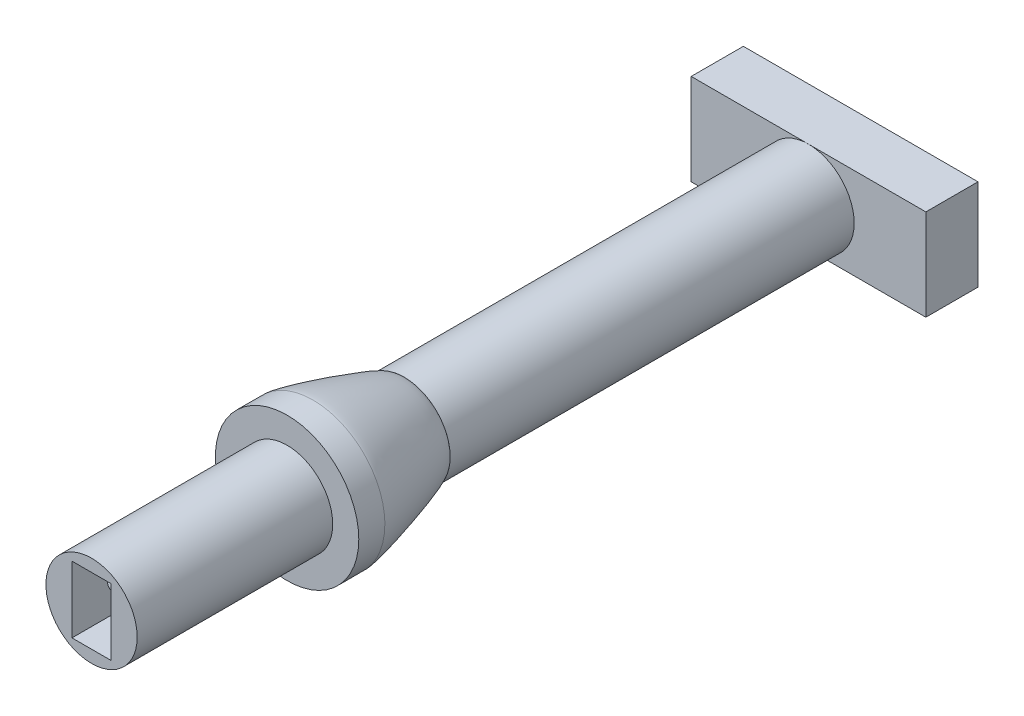
ISO-10303-21;
HEADER;
FILE_DESCRIPTION(('STEP AP214'),'2;1');
FILE_NAME('part.step','',(''),(''),'','','');
FILE_SCHEMA(('AUTOMOTIVE_DESIGN { 1 0 10303 214 1 1 1 1 }'));
ENDSEC;
DATA;
#1=APPLICATION_CONTEXT('core data for automotive mechanical design processes');
#2=APPLICATION_PROTOCOL_DEFINITION('international standard','automotive_design',2000,#1);
#3=PRODUCT_CONTEXT('',#1,'mechanical');
#4=PRODUCT('Part','Part','',(#3));
#5=PRODUCT_RELATED_PRODUCT_CATEGORY('part','',(#4));
#6=PRODUCT_DEFINITION_FORMATION('','',#4);
#7=PRODUCT_DEFINITION_CONTEXT('part definition',#1,'design');
#8=PRODUCT_DEFINITION('design','',#6,#7);
#9=PRODUCT_DEFINITION_SHAPE('','',#8);
#10=(LENGTH_UNIT() NAMED_UNIT(*) SI_UNIT(.MILLI.,.METRE.));
#11=(NAMED_UNIT(*) PLANE_ANGLE_UNIT() SI_UNIT($,.RADIAN.));
#12=(NAMED_UNIT(*) SI_UNIT($,.STERADIAN.) SOLID_ANGLE_UNIT());
#13=UNCERTAINTY_MEASURE_WITH_UNIT(LENGTH_MEASURE(1.E-05),#10,'distance_accuracy_value','');
#14=(GEOMETRIC_REPRESENTATION_CONTEXT(3) GLOBAL_UNCERTAINTY_ASSIGNED_CONTEXT((#13)) GLOBAL_UNIT_ASSIGNED_CONTEXT((#10,
#11,#12)) REPRESENTATION_CONTEXT('',''));
#15=CARTESIAN_POINT('',(0.,0.,0.));
#16=DIRECTION('',(0.,0.,1.));
#17=DIRECTION('',(1.,0.,0.));
#18=AXIS2_PLACEMENT_3D('',#15,#16,#17);
#19=CARTESIAN_POINT('',(0.,0.,59.));
#20=DIRECTION('',(0.,0.,-1.));
#21=DIRECTION('',(-1.,0.,0.));
#22=AXIS2_PLACEMENT_3D('',#19,#20,#21);
#23=CYLINDRICAL_SURFACE('',#22,3.5);
#24=CARTESIAN_POINT('',(0.,0.,4.));
#25=DIRECTION('',(0.,0.,1.));
#26=DIRECTION('',(1.,0.,0.));
#27=AXIS2_PLACEMENT_3D('',#24,#25,#26);
#28=CIRCLE('',#27,3.5);
#29=CARTESIAN_POINT('',(0.,3.5,4.));
#30=VERTEX_POINT('',#29);
#31=CARTESIAN_POINT('',(0.,-3.5,4.));
#32=VERTEX_POINT('',#31);
#33=EDGE_CURVE('E176',#30,#32,#28,.T.);
#34=ORIENTED_EDGE('',*,*,#33,.T.);
#35=EDGE_CURVE('E75',#32,#30,#28,.T.);
#36=ORIENTED_EDGE('',*,*,#35,.T.);
#37=EDGE_LOOP('',(#34,#36));
#38=FACE_BOUND('',#37,.T.);
#39=CARTESIAN_POINT('',(3.5,0.,35.));
#40=CARTESIAN_POINT('',(3.5,0.458148922415161,35.));
#41=CARTESIAN_POINT('',(3.40890436595365,0.916117601016367,35.));
#42=CARTESIAN_POINT('',(3.05825236162537,1.76266642553926,35.));
#43=CARTESIAN_POINT('',(2.79883394398591,2.15091352431983,35.));
#44=CARTESIAN_POINT('',(2.15091352431993,2.79883394398601,35.));
#45=CARTESIAN_POINT('',(1.7626664255393,3.05825236162543,35.));
#46=CARTESIAN_POINT('',(0.916117601016333,3.40890436595358,35.));
#47=CARTESIAN_POINT('',(0.458148922415193,3.5,35.));
#48=CARTESIAN_POINT('',(-0.458148922415193,3.5,35.));
#49=CARTESIAN_POINT('',(-0.916117601016335,3.40890436595368,35.));
#50=CARTESIAN_POINT('',(-1.7626664255393,3.05825236162533,35.));
#51=CARTESIAN_POINT('',(-2.15091352431986,2.79883394398598,35.));
#52=CARTESIAN_POINT('',(-2.79883394398599,2.15091352431985,35.));
#53=CARTESIAN_POINT('',(-3.05825236162517,1.76266642553932,35.));
#54=CARTESIAN_POINT('',(-3.40890436595384,0.91611760101632,35.));
#55=CARTESIAN_POINT('',(-3.5,0.458148922415194,35.));
#56=CARTESIAN_POINT('',(-3.5,-0.458148922415193,35.));
#57=CARTESIAN_POINT('',(-3.40890436595384,-0.916117601016261,35.));
#58=CARTESIAN_POINT('',(-3.05825236162517,-1.76266642553936,35.));
#59=CARTESIAN_POINT('',(-2.79883394398608,-2.15091352431976,35.));
#60=CARTESIAN_POINT('',(-2.15091352431975,-2.79883394398608,35.));
#61=CARTESIAN_POINT('',(-1.76266642553933,-3.05825236162529,35.));
#62=CARTESIAN_POINT('',(-0.916117601016308,-3.40890436595372,35.));
#63=CARTESIAN_POINT('',(-0.458148922415188,-3.5,35.));
#64=CARTESIAN_POINT('',(0.458148922415199,-3.5,35.));
#65=CARTESIAN_POINT('',(0.916117601016347,-3.40890436595372,35.));
#66=CARTESIAN_POINT('',(1.76266642553927,-3.0582523616253,35.));
#67=CARTESIAN_POINT('',(2.15091352431984,-2.7988339439861,35.));
#68=CARTESIAN_POINT('',(2.79883394398598,-2.15091352431976,35.));
#69=CARTESIAN_POINT('',(3.05825236162529,-1.76266642553933,35.));
#70=CARTESIAN_POINT('',(3.40890436595372,-0.916117601016308,35.));
#71=CARTESIAN_POINT('',(3.5,-0.458148922415162,35.));
#72=CARTESIAN_POINT('',(3.5,0.,35.));
#73=(BOUNDED_CURVE() B_SPLINE_CURVE(3,(#39,#40,#41,#42,#43,#44,#45,#46,#47,#48,#49,#50,#51,#52,
#53,#54,#55,#56,#57,#58,#59,#60,#61,#62,#63,#64,#65,#66,#67,#68,#69,#70,#71,#72),.UNSPECIFIED.,
.T.,.F.) B_SPLINE_CURVE_WITH_KNOTS((4,2,2,2,2,2,2,2,2,2,2,2,2,2,2,2,4),(0.,0.392699081698724,
0.785398163397448,1.17809724509617,1.5707963267949,1.96349540849362,2.35619449019234,
2.74889357189107,3.14159265358979,3.53429173528852,3.92699081698724,4.31968989868597,
4.71238898038469,5.10508806208341,5.49778714378214,5.89048622548086,6.28318530717959),
.UNSPECIFIED.) CURVE() GEOMETRIC_REPRESENTATION_ITEM() RATIONAL_B_SPLINE_CURVE((1.,1.,1.,1.,1.,
1.,1.,1.,1.,1.,1.,1.,1.,1.,1.,1.,1.,1.,1.,1.,1.,1.,1.,1.,1.,1.,1.,1.,1.,1.,1.,1.,1.,1.)) REPRESENTATION_ITEM(''));
#74=CARTESIAN_POINT('',(3.5,0.,35.));
#75=VERTEX_POINT('',#74);
#76=EDGE_CURVE('E60',#75,#75,#73,.T.);
#77=ORIENTED_EDGE('',*,*,#76,.F.);
#78=EDGE_LOOP('',(#77));
#79=FACE_BOUND('',#78,.T.);
#80=ADVANCED_FACE('F44',(#38,#79),#23,.T.);
#81=CARTESIAN_POINT('',(0.,0.,4.));
#82=DIRECTION('',(0.,0.,1.));
#83=DIRECTION('',(1.,0.,0.));
#84=AXIS2_PLACEMENT_3D('',#81,#82,#83);
#85=PLANE('',#84);
#86=ORIENTED_EDGE('',*,*,#33,.F.);
#87=DIRECTION('',(-1.,0.,0.));
#88=VECTOR('',#87,1.);
#89=CARTESIAN_POINT('',(-9.00000000000001,3.5,4.));
#90=LINE('',#89,#88);
#91=CARTESIAN_POINT('',(-9.00000000000001,3.5,4.));
#92=VERTEX_POINT('',#91);
#93=EDGE_CURVE('E194',#30,#92,#90,.T.);
#94=ORIENTED_EDGE('',*,*,#93,.T.);
#95=DIRECTION('',(0.,-1.,0.));
#96=VECTOR('',#95,1.);
#97=CARTESIAN_POINT('',(-9.00000000000001,3.5,4.));
#98=LINE('',#97,#96);
#99=CARTESIAN_POINT('',(-9.00000000000001,-3.5,4.));
#100=VERTEX_POINT('',#99);
#101=EDGE_CURVE('E199',#92,#100,#98,.T.);
#102=ORIENTED_EDGE('',*,*,#101,.T.);
#103=DIRECTION('',(1.,0.,0.));
#104=VECTOR('',#103,1.);
#105=CARTESIAN_POINT('',(-9.00000000000001,-3.5,4.));
#106=LINE('',#105,#104);
#107=EDGE_CURVE('E203',#100,#32,#106,.T.);
#108=ORIENTED_EDGE('',*,*,#107,.T.);
#109=EDGE_LOOP('',(#86,#94,#102,#108));
#110=FACE_BOUND('',#109,.T.);
#111=ADVANCED_FACE('F292',(#110),#85,.T.);
#112=CARTESIAN_POINT('',(8.99999999999999,3.5,4.));
#113=DIRECTION('',(-1.,0.,0.));
#114=DIRECTION('',(0.,0.,1.));
#115=AXIS2_PLACEMENT_3D('',#112,#113,#114);
#116=PLANE('',#115);
#117=DIRECTION('',(0.,1.,0.));
#118=VECTOR('',#117,1.);
#119=CARTESIAN_POINT('',(8.99999999999999,3.5,0.));
#120=LINE('',#119,#118);
#121=CARTESIAN_POINT('',(8.99999999999999,-3.5,0.));
#122=VERTEX_POINT('',#121);
#123=CARTESIAN_POINT('',(8.99999999999999,3.5,0.));
#124=VERTEX_POINT('',#123);
#125=EDGE_CURVE('E186',#122,#124,#120,.T.);
#126=ORIENTED_EDGE('',*,*,#125,.T.);
#127=DIRECTION('',(0.,0.,-1.));
#128=VECTOR('',#127,1.);
#129=CARTESIAN_POINT('',(8.99999999999999,3.5,4.));
#130=LINE('',#129,#128);
#131=CARTESIAN_POINT('',(8.99999999999999,3.5,4.));
#132=VERTEX_POINT('',#131);
#133=EDGE_CURVE('E230',#132,#124,#130,.T.);
#134=ORIENTED_EDGE('',*,*,#133,.F.);
#135=DIRECTION('',(0.,1.,0.));
#136=VECTOR('',#135,1.);
#137=CARTESIAN_POINT('',(8.99999999999999,3.5,4.));
#138=LINE('',#137,#136);
#139=CARTESIAN_POINT('',(8.99999999999999,-3.5,4.));
#140=VERTEX_POINT('',#139);
#141=EDGE_CURVE('E190',#140,#132,#138,.T.);
#142=ORIENTED_EDGE('',*,*,#141,.F.);
#143=DIRECTION('',(0.,0.,-1.));
#144=VECTOR('',#143,1.);
#145=CARTESIAN_POINT('',(8.99999999999999,-3.5,4.));
#146=LINE('',#145,#144);
#147=EDGE_CURVE('E207',#140,#122,#146,.T.);
#148=ORIENTED_EDGE('',*,*,#147,.T.);
#149=EDGE_LOOP('',(#126,#134,#142,#148));
#150=FACE_BOUND('',#149,.T.);
#151=ADVANCED_FACE('F305',(#150),#116,.F.);
#152=CARTESIAN_POINT('',(-9.00000000000001,3.5,4.));
#153=DIRECTION('',(0.,-1.,0.));
#154=DIRECTION('',(0.,0.,-1.));
#155=AXIS2_PLACEMENT_3D('',#152,#153,#154);
#156=PLANE('',#155);
#157=DIRECTION('',(-1.,0.,0.));
#158=VECTOR('',#157,1.);
#159=CARTESIAN_POINT('',(-9.00000000000001,3.5,0.));
#160=LINE('',#159,#158);
#161=CARTESIAN_POINT('',(-9.00000000000001,3.5,0.));
#162=VERTEX_POINT('',#161);
#163=EDGE_CURVE('E211',#124,#162,#160,.T.);
#164=ORIENTED_EDGE('',*,*,#163,.T.);
#165=DIRECTION('',(0.,0.,-1.));
#166=VECTOR('',#165,1.);
#167=CARTESIAN_POINT('',(-9.00000000000001,3.5,4.));
#168=LINE('',#167,#166);
#169=EDGE_CURVE('E226',#92,#162,#168,.T.);
#170=ORIENTED_EDGE('',*,*,#169,.F.);
#171=ORIENTED_EDGE('',*,*,#93,.F.);
#172=EDGE_CURVE('E196',#132,#30,#90,.T.);
#173=ORIENTED_EDGE('',*,*,#172,.F.);
#174=ORIENTED_EDGE('',*,*,#133,.T.);
#175=EDGE_LOOP('',(#164,#170,#171,#173,#174));
#176=FACE_BOUND('',#175,.T.);
#177=ADVANCED_FACE('F302',(#176),#156,.F.);
#178=CARTESIAN_POINT('',(-9.00000000000001,3.5,4.));
#179=DIRECTION('',(1.,0.,0.));
#180=DIRECTION('',(0.,1.,0.));
#181=AXIS2_PLACEMENT_3D('',#178,#179,#180);
#182=PLANE('',#181);
#183=DIRECTION('',(0.,-1.,0.));
#184=VECTOR('',#183,1.);
#185=CARTESIAN_POINT('',(-9.00000000000001,3.5,0.));
#186=LINE('',#185,#184);
#187=CARTESIAN_POINT('',(-9.00000000000001,-3.5,0.));
#188=VERTEX_POINT('',#187);
#189=EDGE_CURVE('E214',#162,#188,#186,.T.);
#190=ORIENTED_EDGE('',*,*,#189,.T.);
#191=DIRECTION('',(0.,0.,-1.));
#192=VECTOR('',#191,1.);
#193=CARTESIAN_POINT('',(-9.00000000000001,-3.5,4.));
#194=LINE('',#193,#192);
#195=EDGE_CURVE('E222',#100,#188,#194,.T.);
#196=ORIENTED_EDGE('',*,*,#195,.F.);
#197=ORIENTED_EDGE('',*,*,#101,.F.);
#198=ORIENTED_EDGE('',*,*,#169,.T.);
#199=EDGE_LOOP('',(#190,#196,#197,#198));
#200=FACE_BOUND('',#199,.T.);
#201=ADVANCED_FACE('F298',(#200),#182,.F.);
#202=CARTESIAN_POINT('',(-9.00000000000001,-3.5,4.));
#203=DIRECTION('',(0.,1.,0.));
#204=DIRECTION('',(0.,0.,1.));
#205=AXIS2_PLACEMENT_3D('',#202,#203,#204);
#206=PLANE('',#205);
#207=DIRECTION('',(1.,0.,0.));
#208=VECTOR('',#207,1.);
#209=CARTESIAN_POINT('',(-9.00000000000001,-3.5,0.));
#210=LINE('',#209,#208);
#211=EDGE_CURVE('E195',#188,#122,#210,.T.);
#212=ORIENTED_EDGE('',*,*,#211,.T.);
#213=ORIENTED_EDGE('',*,*,#147,.F.);
#214=EDGE_CURVE('E202',#32,#140,#106,.T.);
#215=ORIENTED_EDGE('',*,*,#214,.F.);
#216=ORIENTED_EDGE('',*,*,#107,.F.);
#217=ORIENTED_EDGE('',*,*,#195,.T.);
#218=EDGE_LOOP('',(#212,#213,#215,#216,#217));
#219=FACE_BOUND('',#218,.T.);
#220=ADVANCED_FACE('F291',(#219),#206,.F.);
#221=ORIENTED_EDGE('',*,*,#35,.F.);
#222=ORIENTED_EDGE('',*,*,#214,.T.);
#223=ORIENTED_EDGE('',*,*,#141,.T.);
#224=ORIENTED_EDGE('',*,*,#172,.T.);
#225=EDGE_LOOP('',(#221,#222,#223,#224));
#226=FACE_BOUND('',#225,.T.);
#227=ADVANCED_FACE('F288',(#226),#85,.T.);
#228=CARTESIAN_POINT('',(0.,0.,0.));
#229=DIRECTION('',(0.,0.,1.));
#230=DIRECTION('',(1.,0.,0.));
#231=AXIS2_PLACEMENT_3D('',#228,#229,#230);
#232=PLANE('',#231);
#233=CARTESIAN_POINT('',(0.,0.,0.));
#234=DIRECTION('',(0.,0.,-1.));
#235=DIRECTION('',(-1.,0.,0.));
#236=AXIS2_PLACEMENT_3D('',#233,#234,#235);
#237=CIRCLE('',#236,1.);
#238=CARTESIAN_POINT('',(-1.,0.,0.));
#239=VERTEX_POINT('',#238);
#240=EDGE_CURVE('E373',#239,#239,#237,.T.);
#241=ORIENTED_EDGE('',*,*,#240,.F.);
#242=EDGE_LOOP('',(#241));
#243=FACE_BOUND('',#242,.T.);
#244=ORIENTED_EDGE('',*,*,#125,.F.);
#245=ORIENTED_EDGE('',*,*,#211,.F.);
#246=ORIENTED_EDGE('',*,*,#189,.F.);
#247=ORIENTED_EDGE('',*,*,#163,.F.);
#248=EDGE_LOOP('',(#244,#245,#246,#247));
#249=FACE_BOUND('',#248,.T.);
#250=ADVANCED_FACE('F258',(#243,#249),#232,.F.);
#251=CARTESIAN_POINT('',(0.,0.,35.));
#252=DIRECTION('',(0.,0.,1.));
#253=DIRECTION('',(1.,0.,0.));
#254=AXIS2_PLACEMENT_3D('',#251,#252,#253);
#255=CYLINDRICAL_SURFACE('',#254,5.5);
#256=CARTESIAN_POINT('',(5.5,0.,42.));
#257=CARTESIAN_POINT('',(5.5,-0.719948306652397,42.));
#258=CARTESIAN_POINT('',(5.35684971792728,-1.43961337302563,42.));
#259=CARTESIAN_POINT('',(4.80582513969687,-2.76990438299038,42.));
#260=CARTESIAN_POINT('',(4.39816762626376,-3.38000696678827,42.));
#261=CARTESIAN_POINT('',(3.38000696678824,-4.39816762626378,42.));
#262=CARTESIAN_POINT('',(2.76990438299028,-4.80582513969692,42.));
#263=CARTESIAN_POINT('',(1.43961337302569,-5.35684971792725,42.));
#264=CARTESIAN_POINT('',(0.719948306652456,-5.5,42.));
#265=CARTESIAN_POINT('',(-0.719948306652438,-5.5,42.));
#266=CARTESIAN_POINT('',(-1.43961337302563,-5.35684971792728,42.));
#267=CARTESIAN_POINT('',(-2.76990438299038,-4.80582513969687,42.));
#268=CARTESIAN_POINT('',(-3.3800069667882,-4.39816762626383,42.));
#269=CARTESIAN_POINT('',(-4.39816762626383,-3.3800069667882,42.));
#270=CARTESIAN_POINT('',(-4.80582513969681,-2.76990438299054,42.));
#271=CARTESIAN_POINT('',(-5.35684971792736,-1.43961337302543,42.));
#272=CARTESIAN_POINT('',(-5.5,-0.719948306652446,42.));
#273=CARTESIAN_POINT('',(-5.5,0.719948306652447,42.));
#274=CARTESIAN_POINT('',(-5.35684971792729,1.4396133730256,42.));
#275=CARTESIAN_POINT('',(-4.80582513969686,2.7699043829904,42.));
#276=CARTESIAN_POINT('',(-4.39816762626363,3.38000696678839,42.));
#277=CARTESIAN_POINT('',(-3.3800069667884,4.39816762626363,42.));
#278=CARTESIAN_POINT('',(-2.76990438299035,4.80582513969689,42.));
#279=CARTESIAN_POINT('',(-1.43961337302564,5.35684971792727,42.));
#280=CARTESIAN_POINT('',(-0.719948306652446,5.5,42.));
#281=CARTESIAN_POINT('',(0.719948306652446,5.5,42.));
#282=CARTESIAN_POINT('',(1.43961337302572,5.35684971792724,42.));
#283=CARTESIAN_POINT('',(2.76990438299026,4.80582513969692,42.));
#284=CARTESIAN_POINT('',(3.38000696678845,4.39816762626358,42.));
#285=CARTESIAN_POINT('',(4.39816762626358,3.38000696678845,42.));
#286=CARTESIAN_POINT('',(4.80582513969691,2.76990438299029,42.));
#287=CARTESIAN_POINT('',(5.35684971792725,1.4396133730257,42.));
#288=CARTESIAN_POINT('',(5.5,0.719948306652396,42.));
#289=CARTESIAN_POINT('',(5.5,0.,42.));
#290=(BOUNDED_CURVE() B_SPLINE_CURVE(3,(#256,#257,#258,#259,#260,#261,#262,#263,#264,#265,#266,
#267,#268,#269,#270,#271,#272,#273,#274,#275,#276,#277,#278,#279,#280,#281,#282,#283,#284,#285,
#286,#287,#288,#289),.UNSPECIFIED.,.T.,.F.) B_SPLINE_CURVE_WITH_KNOTS((4,2,2,2,2,2,2,2,2,2,2,2,
2,2,2,2,4),(0.,0.392699081698725,0.785398163397448,1.17809724509617,1.5707963267949,
1.96349540849362,2.35619449019234,2.74889357189107,3.14159265358979,3.53429173528852,
3.92699081698724,4.31968989868597,4.71238898038469,5.10508806208341,5.49778714378214,
5.89048622548086,6.28318530717959),
.UNSPECIFIED.) CURVE() GEOMETRIC_REPRESENTATION_ITEM() RATIONAL_B_SPLINE_CURVE((1.,1.,1.,1.,1.,
1.,1.,1.,1.,1.,1.,1.,1.,1.,1.,1.,1.,1.,1.,1.,1.,1.,1.,1.,1.,1.,1.,1.,1.,1.,1.,1.,1.,1.)) REPRESENTATION_ITEM(''));
#291=CARTESIAN_POINT('',(5.5,0.,42.));
#292=VERTEX_POINT('',#291);
#293=EDGE_CURVE('E12',#292,#292,#290,.F.);
#294=ORIENTED_EDGE('',*,*,#293,.T.);
#295=EDGE_LOOP('',(#294));
#296=FACE_BOUND('',#295,.T.);
#297=CARTESIAN_POINT('',(0.,0.,44.));
#298=DIRECTION('',(0.,0.,1.));
#299=DIRECTION('',(1.,0.,0.));
#300=AXIS2_PLACEMENT_3D('',#297,#298,#299);
#301=CIRCLE('',#300,5.5);
#302=CARTESIAN_POINT('',(5.5,0.,44.));
#303=VERTEX_POINT('',#302);
#304=EDGE_CURVE('E239',#303,#303,#301,.T.);
#305=ORIENTED_EDGE('',*,*,#304,.F.);
#306=EDGE_LOOP('',(#305));
#307=FACE_BOUND('',#306,.T.);
#308=ADVANCED_FACE('F248',(#296,#307),#255,.T.);
#309=CARTESIAN_POINT('',(0.,0.,44.));
#310=DIRECTION('',(0.,0.,1.));
#311=DIRECTION('',(1.,0.,0.));
#312=AXIS2_PLACEMENT_3D('',#309,#310,#311);
#313=PLANE('',#312);
#314=CARTESIAN_POINT('',(0.,0.,44.));
#315=DIRECTION('',(0.,0.,1.));
#316=DIRECTION('',(1.,0.,0.));
#317=AXIS2_PLACEMENT_3D('',#314,#315,#316);
#318=CIRCLE('',#317,3.5);
#319=CARTESIAN_POINT('',(3.5,0.,44.));
#320=VERTEX_POINT('',#319);
#321=EDGE_CURVE('E234',#320,#320,#318,.T.);
#322=ORIENTED_EDGE('',*,*,#321,.F.);
#323=EDGE_LOOP('',(#322));
#324=FACE_BOUND('',#323,.T.);
#325=ORIENTED_EDGE('',*,*,#304,.T.);
#326=EDGE_LOOP('',(#325));
#327=FACE_BOUND('',#326,.T.);
#328=ADVANCED_FACE('F257',(#324,#327),#313,.T.);
#329=CARTESIAN_POINT('',(0.,0.,50.8));
#330=DIRECTION('',(0.,0.,1.));
#331=DIRECTION('',(1.,0.,0.));
#332=AXIS2_PLACEMENT_3D('',#329,#330,#331);
#333=PLANE('',#332);
#334=DIRECTION('',(0.,1.,0.));
#335=VECTOR('',#334,1.);
#336=CARTESIAN_POINT('',(1.5,2.55,50.8));
#337=LINE('',#336,#335);
#338=CARTESIAN_POINT('',(1.5,-2.55,50.8));
#339=VERTEX_POINT('',#338);
#340=CARTESIAN_POINT('',(1.5,2.55,50.8));
#341=VERTEX_POINT('',#340);
#342=EDGE_CURVE('E125',#339,#341,#337,.T.);
#343=ORIENTED_EDGE('',*,*,#342,.T.);
#344=DIRECTION('',(-1.,0.,0.));
#345=VECTOR('',#344,1.);
#346=CARTESIAN_POINT('',(-1.5,2.55,50.8));
#347=LINE('',#346,#345);
#348=CARTESIAN_POINT('',(-1.5,2.55,50.8));
#349=VERTEX_POINT('',#348);
#350=EDGE_CURVE('E135',#341,#349,#347,.T.);
#351=ORIENTED_EDGE('',*,*,#350,.T.);
#352=DIRECTION('',(0.,-1.,0.));
#353=VECTOR('',#352,1.);
#354=CARTESIAN_POINT('',(-1.5,2.55,50.8));
#355=LINE('',#354,#353);
#356=CARTESIAN_POINT('',(-1.5,-2.55,50.8));
#357=VERTEX_POINT('',#356);
#358=EDGE_CURVE('E141',#349,#357,#355,.T.);
#359=ORIENTED_EDGE('',*,*,#358,.T.);
#360=DIRECTION('',(1.,0.,0.));
#361=VECTOR('',#360,1.);
#362=CARTESIAN_POINT('',(-1.5,-2.55,50.8));
#363=LINE('',#362,#361);
#364=EDGE_CURVE('E132',#357,#339,#363,.T.);
#365=ORIENTED_EDGE('',*,*,#364,.T.);
#366=EDGE_LOOP('',(#343,#351,#359,#365));
#367=FACE_BOUND('',#366,.T.);
#368=ADVANCED_FACE('F143',(#367),#333,.T.);
#369=CARTESIAN_POINT('',(-1.5,2.55,50.8));
#370=DIRECTION('',(0.,1.,0.));
#371=DIRECTION('',(0.,0.,1.));
#372=AXIS2_PLACEMENT_3D('',#369,#370,#371);
#373=PLANE('',#372);
#374=DIRECTION('',(-1.,0.,0.));
#375=VECTOR('',#374,1.);
#376=CARTESIAN_POINT('',(-1.5,2.55,59.));
#377=LINE('',#376,#375);
#378=CARTESIAN_POINT('',(1.5,2.55,59.));
#379=VERTEX_POINT('',#378);
#380=CARTESIAN_POINT('',(-1.5,2.55,59.));
#381=VERTEX_POINT('',#380);
#382=EDGE_CURVE('E167',#379,#381,#377,.T.);
#383=ORIENTED_EDGE('',*,*,#382,.T.);
#384=DIRECTION('',(0.,0.,1.));
#385=VECTOR('',#384,1.);
#386=CARTESIAN_POINT('',(-1.5,2.55,50.8));
#387=LINE('',#386,#385);
#388=EDGE_CURVE('E131',#349,#381,#387,.T.);
#389=ORIENTED_EDGE('',*,*,#388,.F.);
#390=ORIENTED_EDGE('',*,*,#350,.F.);
#391=DIRECTION('',(0.,0.,1.));
#392=VECTOR('',#391,1.);
#393=CARTESIAN_POINT('',(1.5,2.55,50.8));
#394=LINE('',#393,#392);
#395=EDGE_CURVE('E121',#341,#379,#394,.T.);
#396=ORIENTED_EDGE('',*,*,#395,.T.);
#397=EDGE_LOOP('',(#383,#389,#390,#396));
#398=FACE_BOUND('',#397,.T.);
#399=ADVANCED_FACE('F136',(#398),#373,.F.);
#400=CARTESIAN_POINT('',(-1.5,-2.55,50.8));
#401=DIRECTION('',(0.,-1.,0.));
#402=DIRECTION('',(0.,0.,-1.));
#403=AXIS2_PLACEMENT_3D('',#400,#401,#402);
#404=PLANE('',#403);
#405=DIRECTION('',(1.,0.,0.));
#406=VECTOR('',#405,1.);
#407=CARTESIAN_POINT('',(-1.5,-2.55,59.));
#408=LINE('',#407,#406);
#409=CARTESIAN_POINT('',(-1.5,-2.55,59.));
#410=VERTEX_POINT('',#409);
#411=CARTESIAN_POINT('',(1.5,-2.55,59.));
#412=VERTEX_POINT('',#411);
#413=EDGE_CURVE('E146',#410,#412,#408,.T.);
#414=ORIENTED_EDGE('',*,*,#413,.T.);
#415=DIRECTION('',(0.,0.,1.));
#416=VECTOR('',#415,1.);
#417=CARTESIAN_POINT('',(1.5,-2.55,50.8));
#418=LINE('',#417,#416);
#419=EDGE_CURVE('E173',#339,#412,#418,.T.);
#420=ORIENTED_EDGE('',*,*,#419,.F.);
#421=ORIENTED_EDGE('',*,*,#364,.F.);
#422=DIRECTION('',(0.,0.,1.));
#423=VECTOR('',#422,1.);
#424=CARTESIAN_POINT('',(-1.5,-2.55,50.8));
#425=LINE('',#424,#423);
#426=EDGE_CURVE('E177',#357,#410,#425,.T.);
#427=ORIENTED_EDGE('',*,*,#426,.T.);
#428=EDGE_LOOP('',(#414,#420,#421,#427));
#429=FACE_BOUND('',#428,.T.);
#430=ADVANCED_FACE('F270',(#429),#404,.F.);
#431=CARTESIAN_POINT('',(1.5,2.55,50.8));
#432=DIRECTION('',(1.,0.,0.));
#433=DIRECTION('',(0.,1.,0.));
#434=AXIS2_PLACEMENT_3D('',#431,#432,#433);
#435=PLANE('',#434);
#436=DIRECTION('',(0.,1.,0.));
#437=VECTOR('',#436,1.);
#438=CARTESIAN_POINT('',(1.5,2.55,59.));
#439=LINE('',#438,#437);
#440=EDGE_CURVE('E67',#412,#379,#439,.T.);
#441=ORIENTED_EDGE('',*,*,#440,.T.);
#442=ORIENTED_EDGE('',*,*,#395,.F.);
#443=ORIENTED_EDGE('',*,*,#342,.F.);
#444=ORIENTED_EDGE('',*,*,#419,.T.);
#445=EDGE_LOOP('',(#441,#442,#443,#444));
#446=FACE_BOUND('',#445,.T.);
#447=ADVANCED_FACE('F123',(#446),#435,.F.);
#448=CARTESIAN_POINT('',(-1.5,2.55,50.8));
#449=DIRECTION('',(-1.,0.,0.));
#450=DIRECTION('',(0.,-1.,0.));
#451=AXIS2_PLACEMENT_3D('',#448,#449,#450);
#452=PLANE('',#451);
#453=CARTESIAN_POINT('',(-1.5,0.,54.8));
#454=DIRECTION('',(1.,0.,0.));
#455=DIRECTION('',(0.,1.,0.));
#456=AXIS2_PLACEMENT_3D('',#453,#454,#455);
#457=CIRCLE('',#456,1.5);
#458=CARTESIAN_POINT('',(-1.5,1.5,54.8));
#459=VERTEX_POINT('',#458);
#460=EDGE_CURVE('E238',#459,#459,#457,.T.);
#461=ORIENTED_EDGE('',*,*,#460,.F.);
#462=EDGE_LOOP('',(#461));
#463=FACE_BOUND('',#462,.T.);
#464=DIRECTION('',(0.,-1.,0.));
#465=VECTOR('',#464,1.);
#466=CARTESIAN_POINT('',(-1.5,2.55,59.));
#467=LINE('',#466,#465);
#468=EDGE_CURVE('E150',#381,#410,#467,.T.);
#469=ORIENTED_EDGE('',*,*,#468,.T.);
#470=ORIENTED_EDGE('',*,*,#426,.F.);
#471=ORIENTED_EDGE('',*,*,#358,.F.);
#472=ORIENTED_EDGE('',*,*,#388,.T.);
#473=EDGE_LOOP('',(#469,#470,#471,#472));
#474=FACE_BOUND('',#473,.T.);
#475=ADVANCED_FACE('F274',(#463,#474),#452,.F.);
#476=CARTESIAN_POINT('',(0.,0.,59.));
#477=DIRECTION('',(0.,0.,1.));
#478=DIRECTION('',(1.,0.,0.));
#479=AXIS2_PLACEMENT_3D('',#476,#477,#478);
#480=PLANE('',#479);
#481=ORIENTED_EDGE('',*,*,#440,.F.);
#482=ORIENTED_EDGE('',*,*,#413,.F.);
#483=ORIENTED_EDGE('',*,*,#468,.F.);
#484=ORIENTED_EDGE('',*,*,#382,.F.);
#485=EDGE_LOOP('',(#481,#482,#483,#484));
#486=FACE_BOUND('',#485,.T.);
#487=CARTESIAN_POINT('',(0.,0.,59.));
#488=DIRECTION('',(0.,0.,1.));
#489=DIRECTION('',(1.,0.,0.));
#490=AXIS2_PLACEMENT_3D('',#487,#488,#489);
#491=CIRCLE('',#490,3.5);
#492=CARTESIAN_POINT('',(3.5,0.,59.));
#493=VERTEX_POINT('',#492);
#494=EDGE_CURVE('E182',#493,#493,#491,.T.);
#495=ORIENTED_EDGE('',*,*,#494,.T.);
#496=EDGE_LOOP('',(#495));
#497=FACE_BOUND('',#496,.T.);
#498=ADVANCED_FACE('F266',(#486,#497),#480,.T.);
#499=CARTESIAN_POINT('',(-9.00100000000001,0.,54.8));
#500=DIRECTION('',(1.,0.,0.));
#501=DIRECTION('',(0.,1.,0.));
#502=AXIS2_PLACEMENT_3D('',#499,#500,#501);
#503=CYLINDRICAL_SURFACE('',#502,1.5);
#504=ORIENTED_EDGE('',*,*,#460,.T.);
#505=EDGE_LOOP('',(#504));
#506=FACE_BOUND('',#505,.T.);
#507=CARTESIAN_POINT('',(-3.16227766016838,1.5,54.8));
#508=CARTESIAN_POINT('',(-3.16228717298615,1.49999038492545,54.7202310669546));
#509=CARTESIAN_POINT('',(-3.16534018013075,1.49359660659694,54.6403418583581));
#510=CARTESIAN_POINT('',(-3.17716042981265,1.46827542593982,54.4828833369264));
#511=CARTESIAN_POINT('',(-3.18594276667924,1.44931491353816,54.4053207198615));
#512=CARTESIAN_POINT('',(-3.20802619745321,1.39974825661799,54.2550840582022));
#513=CARTESIAN_POINT('',(-3.22130811955254,1.3691914561727,54.1823908146556));
#514=CARTESIAN_POINT('',(-3.25086693275558,1.29744502147729,54.0431820705643));
#515=CARTESIAN_POINT('',(-3.26714323581242,1.25625747429104,53.9766653609032));
#516=CARTESIAN_POINT('',(-3.30205565130511,1.16151711863134,53.8472750843835));
#517=CARTESIAN_POINT('',(-3.32077467653238,1.10737213961854,53.7848572691847));
#518=CARTESIAN_POINT('',(-3.3577839083269,0.989495816865002,53.6696486675996));
#519=CARTESIAN_POINT('',(-3.37607394135677,0.925760668427732,53.6168617205288));
#520=CARTESIAN_POINT('',(-3.41118222051011,0.786887444118552,53.5200404953643));
#521=CARTESIAN_POINT('',(-3.42789293367331,0.711357726755064,53.4765254048694));
#522=CARTESIAN_POINT('',(-3.4569371087723,0.553203581147159,53.4030178857841));
#523=CARTESIAN_POINT('',(-3.46927262014747,0.47058249723845,53.3730191240674));
#524=CARTESIAN_POINT('',(-3.48758735586713,0.305382130945822,53.3290674894389));
#525=CARTESIAN_POINT('',(-3.49387724164572,0.223047558846181,53.3143269675171));
#526=CARTESIAN_POINT('',(-3.50052462942355,0.0568497000057502,53.2987586496056));
#527=CARTESIAN_POINT('',(-3.50088468598068,-0.0270129128697541,53.2979248626218));
#528=CARTESIAN_POINT('',(-3.49581016618033,-0.188134207596879,53.3097951243902));
#529=CARTESIAN_POINT('',(-3.49074679776829,-0.265470719086097,53.3216318999745));
#530=CARTESIAN_POINT('',(-3.47591102813446,-0.416935858912371,53.3570120343274));
#531=CARTESIAN_POINT('',(-3.46613827891648,-0.491064249746505,53.3805562582134));
#532=CARTESIAN_POINT('',(-3.44263346664963,-0.635378985342398,53.4389532948628));
#533=CARTESIAN_POINT('',(-3.42884310391306,-0.705487647304975,53.4739736461748));
#534=CARTESIAN_POINT('',(-3.39863837501696,-0.839017665141783,53.5541586776779));
#535=CARTESIAN_POINT('',(-3.38222306678434,-0.90243660651252,53.5993270022658));
#536=CARTESIAN_POINT('',(-3.34696895152064,-1.02577392003805,53.7024047533429));
#537=CARTESIAN_POINT('',(-3.32804069559209,-1.08508648843664,53.7610094348956));
#538=CARTESIAN_POINT('',(-3.29078815665823,-1.19331308888253,53.8873514158162));
#539=CARTESIAN_POINT('',(-3.27246413723674,-1.24222263226407,53.9550926368739));
#540=CARTESIAN_POINT('',(-3.23783417736942,-1.32993971380651,54.1008899372612));
#541=CARTESIAN_POINT('',(-3.22162619167355,-1.36831384702014,54.179232072845));
#542=CARTESIAN_POINT('',(-3.19424697319981,-1.43107385954866,54.3421445042791));
#543=CARTESIAN_POINT('',(-3.18307189830842,-1.45547041320372,54.4267099916605));
#544=CARTESIAN_POINT('',(-3.16799275229804,-1.48799335058118,54.5935863977836));
#545=CARTESIAN_POINT('',(-3.16364898851199,-1.49710640039856,54.6756644902977));
#546=CARTESIAN_POINT('',(-3.16146494308516,-1.50171565988817,54.8402744875602));
#547=CARTESIAN_POINT('',(-3.16362218505066,-1.49721705457355,54.9228062075553));
#548=CARTESIAN_POINT('',(-3.17374071577831,-1.47563239208818,55.0799312868702));
#549=CARTESIAN_POINT('',(-3.18128847435202,-1.45944230541442,55.1546778701854));
#550=CARTESIAN_POINT('',(-3.2007978650071,-1.41614006363835,55.3003227381853));
#551=CARTESIAN_POINT('',(-3.21276056926751,-1.38902525529709,55.3712200832728));
#552=CARTESIAN_POINT('',(-3.24038333624189,-1.32334189052693,55.510604945145));
#553=CARTESIAN_POINT('',(-3.25618154123647,-1.28432659707742,55.5788536609093));
#554=CARTESIAN_POINT('',(-3.28950916992049,-1.19638562157087,55.7081753527573));
#555=CARTESIAN_POINT('',(-3.3070393706057,-1.14745548114547,55.7692450811052));
#556=CARTESIAN_POINT('',(-3.34369698282831,-1.03605747720159,55.8880144627796));
#557=CARTESIAN_POINT('',(-3.36283055507213,-0.972781802419173,55.9449576185857));
#558=CARTESIAN_POINT('',(-3.39913473749074,-0.837142334524679,56.0475671186635));
#559=CARTESIAN_POINT('',(-3.41630515097051,-0.764777632276176,56.0932323334939));
#560=CARTESIAN_POINT('',(-3.44690719585056,-0.612290393672594,56.1720413448053));
#561=CARTESIAN_POINT('',(-3.46032004460384,-0.532131490582578,56.2051225227759));
#562=CARTESIAN_POINT('',(-3.481738302467,-0.366659881518577,56.2570748994456));
#563=CARTESIAN_POINT('',(-3.48974713693763,-0.281350477650405,56.2759551003755));
#564=CARTESIAN_POINT('',(-3.49904040627988,-0.114740191834876,56.2977887288074));
#565=CARTESIAN_POINT('',(-3.50077418524232,-0.0336030421542977,56.3018069056777));
#566=CARTESIAN_POINT('',(-3.49858700907225,0.128169808807156,56.2967022452109));
#567=CARTESIAN_POINT('',(-3.49466715001972,0.208805604242763,56.2875819550501));
#568=CARTESIAN_POINT('',(-3.48185611932799,0.364022405138264,56.257223231529));
#569=CARTESIAN_POINT('',(-3.47316550610207,0.438716867066036,56.2364730162902));
#570=CARTESIAN_POINT('',(-3.45179100848821,0.583524431853931,56.1839919680782));
#571=CARTESIAN_POINT('',(-3.43910638916064,0.653636688669979,56.152259114076));
#572=CARTESIAN_POINT('',(-3.41024047270082,0.790820855389588,56.077104822088));
#573=CARTESIAN_POINT('',(-3.39392604407178,0.857608099366128,56.0332161473868));
#574=CARTESIAN_POINT('',(-3.35970811620735,0.983159576175439,55.9356600352708));
#575=CARTESIAN_POINT('',(-3.341803989688,1.04192061850001,55.8819887288223));
#576=CARTESIAN_POINT('',(-3.30477972078024,1.15419921481672,55.7618044913906));
#577=CARTESIAN_POINT('',(-3.28566570654981,1.20702595263292,55.6946419918799));
#578=CARTESIAN_POINT('',(-3.24969238680824,1.30078077887624,55.5518407424578));
#579=CARTESIAN_POINT('',(-3.23283439654742,1.34170194259387,55.4761970948967));
#580=CARTESIAN_POINT('',(-3.20355631016088,1.41018371094568,55.3184264300847));
#581=CARTESIAN_POINT('',(-3.19112824877804,1.43776832759537,55.2363113768649));
#582=CARTESIAN_POINT('',(-3.17252771438392,1.47837340972957,55.0680448200845));
#583=CARTESIAN_POINT('',(-3.16633426473114,1.49144272805065,54.9819078790467));
#584=CARTESIAN_POINT('',(-3.16275406284903,1.49899243118202,54.8636011550783));
#585=CARTESIAN_POINT('',(-3.16227386666053,1.50000383428567,54.8318101409096));
#586=CARTESIAN_POINT('',(-3.16227766016838,1.5,54.8));
#587=B_SPLINE_CURVE_WITH_KNOTS('',3,(#507,#508,#509,#510,#511,#512,#513,#514,#515,#516,#517,
#518,#519,#520,#521,#522,#523,#524,#525,#526,#527,#528,#529,#530,#531,#532,#533,#534,#535,#536,
#537,#538,#539,#540,#541,#542,#543,#544,#545,#546,#547,#548,#549,#550,#551,#552,#553,#554,#555,
#556,#557,#558,#559,#560,#561,#562,#563,#564,#565,#566,#567,#568,#569,#570,#571,#572,#573,#574,
#575,#576,#577,#578,#579,#580,#581,#582,#583,#584,#585,#586),.UNSPECIFIED.,.T.,.F.,(4,2,2,2,2,2,
2,2,2,2,2,2,2,2,2,2,2,2,2,2,2,2,2,2,2,2,2,2,2,2,2,2,2,2,2,2,2,2,2,4),(0.,0.239211516998634,
0.4790558129253,0.717890772651938,0.95667887911583,1.20974703533055,1.46291585698786,
1.72782087173742,1.99260163484401,2.24290515697657,2.49310084605823,2.72720452587286,
2.96132550725883,3.19902917219045,3.43681833943189,3.69219429883403,3.94768022455397,
4.21248245374588,4.47708218938961,4.72382987542103,4.97048358104409,5.20000580849602,
5.42958381263241,5.66914358774549,5.90881132472031,6.1693483722138,6.42991150089541,
6.6917547467939,6.95343186577335,7.19595274449673,7.43842661162277,7.67141114258538,
7.90443857025999,8.14809791325952,8.39185383353306,8.65331392763675,8.91492579368385,
9.17606486564866,9.43632235654436,9.53171478279886),.UNSPECIFIED.);
#588=CARTESIAN_POINT('',(-3.16227766016838,1.5,54.8));
#589=VERTEX_POINT('',#588);
#590=EDGE_CURVE('E153',#589,#589,#587,.T.);
#591=ORIENTED_EDGE('',*,*,#590,.T.);
#592=EDGE_LOOP('',(#591));
#593=FACE_BOUND('',#592,.T.);
#594=ADVANCED_FACE('F261',(#506,#593),#503,.F.);
#595=ORIENTED_EDGE('',*,*,#321,.T.);
#596=EDGE_LOOP('',(#595));
#597=FACE_BOUND('',#596,.T.);
#598=ORIENTED_EDGE('',*,*,#590,.F.);
#599=EDGE_LOOP('',(#598));
#600=FACE_BOUND('',#599,.T.);
#601=ORIENTED_EDGE('',*,*,#494,.F.);
#602=EDGE_LOOP('',(#601));
#603=FACE_BOUND('',#602,.T.);
#604=ADVANCED_FACE('F265',(#597,#600,#603),#23,.T.);
#605=CARTESIAN_POINT('',(5.5,0.,42.));
#606=CARTESIAN_POINT('',(5.5,0.719948306652396,42.));
#607=CARTESIAN_POINT('',(5.35684971792725,1.4396133730257,42.));
#608=CARTESIAN_POINT('',(4.80582513969691,2.76990438299029,42.));
#609=CARTESIAN_POINT('',(4.39816762626358,3.38000696678845,42.));
#610=CARTESIAN_POINT('',(3.38000696678845,4.39816762626358,42.));
#611=CARTESIAN_POINT('',(2.76990438299026,4.80582513969692,42.));
#612=CARTESIAN_POINT('',(1.43961337302572,5.35684971792724,42.));
#613=CARTESIAN_POINT('',(0.719948306652446,5.5,42.));
#614=CARTESIAN_POINT('',(-0.719948306652446,5.5,42.));
#615=CARTESIAN_POINT('',(-1.43961337302564,5.35684971792727,42.));
#616=CARTESIAN_POINT('',(-2.76990438299035,4.80582513969689,42.));
#617=CARTESIAN_POINT('',(-3.3800069667884,4.39816762626363,42.));
#618=CARTESIAN_POINT('',(-4.39816762626363,3.38000696678839,42.));
#619=CARTESIAN_POINT('',(-4.80582513969686,2.7699043829904,42.));
#620=CARTESIAN_POINT('',(-5.35684971792729,1.4396133730256,42.));
#621=CARTESIAN_POINT('',(-5.5,0.719948306652447,42.));
#622=CARTESIAN_POINT('',(-5.5,-0.719948306652446,42.));
#623=CARTESIAN_POINT('',(-5.35684971792736,-1.43961337302543,42.));
#624=CARTESIAN_POINT('',(-4.80582513969681,-2.76990438299054,42.));
#625=CARTESIAN_POINT('',(-4.39816762626383,-3.3800069667882,42.));
#626=CARTESIAN_POINT('',(-3.3800069667882,-4.39816762626383,42.));
#627=CARTESIAN_POINT('',(-2.76990438299038,-4.80582513969687,42.));
#628=CARTESIAN_POINT('',(-1.43961337302563,-5.35684971792728,42.));
#629=CARTESIAN_POINT('',(-0.719948306652438,-5.5,42.));
#630=CARTESIAN_POINT('',(0.719948306652456,-5.5,42.));
#631=CARTESIAN_POINT('',(1.43961337302569,-5.35684971792725,42.));
#632=CARTESIAN_POINT('',(2.76990438299028,-4.80582513969692,42.));
#633=CARTESIAN_POINT('',(3.38000696678824,-4.39816762626378,42.));
#634=CARTESIAN_POINT('',(4.39816762626376,-3.38000696678827,42.));
#635=CARTESIAN_POINT('',(4.80582513969687,-2.76990438299038,42.));
#636=CARTESIAN_POINT('',(5.35684971792728,-1.43961337302563,42.));
#637=CARTESIAN_POINT('',(5.5,-0.719948306652397,42.));
#638=CARTESIAN_POINT('',(5.5,0.,42.));
#639=CARTESIAN_POINT('',(5.49999999999998,0.,35.));
#640=CARTESIAN_POINT('',(5.49999999999998,0.719948306652393,35.));
#641=CARTESIAN_POINT('',(5.3568497179273,1.43961337302572,35.));
#642=CARTESIAN_POINT('',(4.80582513969681,2.76990438299025,35.));
#643=CARTESIAN_POINT('',(4.39816762626341,3.38000696678848,35.));
#644=CARTESIAN_POINT('',(3.38000696678858,4.39816762626351,35.));
#645=CARTESIAN_POINT('',(2.76990438299038,4.80582513969696,35.));
#646=CARTESIAN_POINT('',(1.43961337302559,5.35684971792716,35.));
#647=CARTESIAN_POINT('',(0.719948306652443,5.49999999999998,35.));
#648=CARTESIAN_POINT('',(-0.719948306652443,5.49999999999998,35.));
#649=CARTESIAN_POINT('',(-1.4396133730257,5.35684971792716,35.));
#650=CARTESIAN_POINT('',(-2.76990438299028,4.80582513969695,35.));
#651=CARTESIAN_POINT('',(-3.38000696678848,4.39816762626351,35.));
#652=CARTESIAN_POINT('',(-4.39816762626352,3.38000696678848,35.));
#653=CARTESIAN_POINT('',(-4.80582513969677,2.76990438299036,35.));
#654=CARTESIAN_POINT('',(-5.35684971792734,1.43961337302562,35.));
#655=CARTESIAN_POINT('',(-5.49999999999998,0.719948306652444,35.));
#656=CARTESIAN_POINT('',(-5.49999999999998,-0.719948306652443,35.));
#657=CARTESIAN_POINT('',(-5.35684971792735,-1.43961337302541,35.0000000000016));
#658=CARTESIAN_POINT('',(-4.80582513969677,-2.76990438299055,34.9999999999984));
#659=CARTESIAN_POINT('',(-4.39816762626371,-3.38000696678818,35.));
#660=CARTESIAN_POINT('',(-3.38000696678828,-4.39816762626381,35.));
#661=CARTESIAN_POINT('',(-2.76990438299041,-4.80582513969694,35.));
#662=CARTESIAN_POINT('',(-1.43961337302558,-5.35684971792717,35.));
#663=CARTESIAN_POINT('',(-0.719948306652435,-5.49999999999998,35.));
#664=CARTESIAN_POINT('',(0.719948306652453,-5.49999999999998,35.));
#665=CARTESIAN_POINT('',(1.43961337302556,-5.35684971792718,35.));
#666=CARTESIAN_POINT('',(2.76990438299039,-4.80582513969694,35.));
#667=CARTESIAN_POINT('',(3.38000696678818,-4.39816762626382,35.));
#668=CARTESIAN_POINT('',(4.3981676262638,-3.3800069667882,35.));
#669=CARTESIAN_POINT('',(4.80582513969694,-2.76990438299031,35.));
#670=CARTESIAN_POINT('',(5.35684971792717,-1.43961337302568,35.));
#671=CARTESIAN_POINT('',(5.49999999999998,-0.719948306652393,35.));
#672=CARTESIAN_POINT('',(5.49999999999998,0.,35.));
#673=CARTESIAN_POINT('',(3.5,0.,35.));
#674=CARTESIAN_POINT('',(3.5,0.458148922415161,35.));
#675=CARTESIAN_POINT('',(3.40890436595365,0.916117601016367,35.));
#676=CARTESIAN_POINT('',(3.05825236162537,1.76266642553926,35.));
#677=CARTESIAN_POINT('',(2.79883394398591,2.15091352431983,35.));
#678=CARTESIAN_POINT('',(2.15091352431993,2.79883394398601,35.));
#679=CARTESIAN_POINT('',(1.7626664255393,3.05825236162543,35.));
#680=CARTESIAN_POINT('',(0.916117601016333,3.40890436595358,35.));
#681=CARTESIAN_POINT('',(0.458148922415193,3.5,35.));
#682=CARTESIAN_POINT('',(-0.458148922415193,3.5,35.));
#683=CARTESIAN_POINT('',(-0.916117601016335,3.40890436595368,35.));
#684=CARTESIAN_POINT('',(-1.7626664255393,3.05825236162533,35.));
#685=CARTESIAN_POINT('',(-2.15091352431986,2.79883394398598,35.));
#686=CARTESIAN_POINT('',(-2.79883394398599,2.15091352431985,35.));
#687=CARTESIAN_POINT('',(-3.05825236162517,1.76266642553932,35.));
#688=CARTESIAN_POINT('',(-3.40890436595384,0.91611760101632,35.));
#689=CARTESIAN_POINT('',(-3.5,0.458148922415194,35.));
#690=CARTESIAN_POINT('',(-3.5,-0.458148922415193,35.));
#691=CARTESIAN_POINT('',(-3.40890436595384,-0.916117601016261,35.));
#692=CARTESIAN_POINT('',(-3.05825236162517,-1.76266642553936,35.));
#693=CARTESIAN_POINT('',(-2.79883394398608,-2.15091352431976,35.));
#694=CARTESIAN_POINT('',(-2.15091352431975,-2.79883394398608,35.));
#695=CARTESIAN_POINT('',(-1.76266642553933,-3.05825236162529,35.));
#696=CARTESIAN_POINT('',(-0.916117601016308,-3.40890436595372,35.));
#697=CARTESIAN_POINT('',(-0.458148922415188,-3.5,35.));
#698=CARTESIAN_POINT('',(0.458148922415199,-3.5,35.));
#699=CARTESIAN_POINT('',(0.916117601016347,-3.40890436595372,35.));
#700=CARTESIAN_POINT('',(1.76266642553927,-3.0582523616253,35.));
#701=CARTESIAN_POINT('',(2.15091352431984,-2.7988339439861,35.));
#702=CARTESIAN_POINT('',(2.79883394398598,-2.15091352431976,35.));
#703=CARTESIAN_POINT('',(3.05825236162529,-1.76266642553933,35.));
#704=CARTESIAN_POINT('',(3.40890436595372,-0.916117601016308,35.));
#705=CARTESIAN_POINT('',(3.5,-0.458148922415162,35.));
#706=CARTESIAN_POINT('',(3.5,0.,35.));
#707=(BOUNDED_SURFACE() B_SPLINE_SURFACE(2,3,((#605,#606,#607,#608,#609,#610,#611,#612,#613,
#614,#615,#616,#617,#618,#619,#620,#621,#622,#623,#624,#625,#626,#627,#628,#629,#630,#631,#632,
#633,#634,#635,#636,#637,#638),(#639,#640,#641,#642,#643,#644,#645,#646,#647,#648,#649,#650,
#651,#652,#653,#654,#655,#656,#657,#658,#659,#660,#661,#662,#663,#664,#665,#666,#667,#668,#669,
#670,#671,#672),(#673,#674,#675,#676,#677,#678,#679,#680,#681,#682,#683,#684,#685,#686,#687,
#688,#689,#690,#691,#692,#693,#694,#695,#696,#697,#698,#699,#700,#701,#702,#703,#704,#705,
#706)),.UNSPECIFIED.,.F.,.T.,.F.) B_SPLINE_SURFACE_WITH_KNOTS((3,3),(4,2,2,2,2,2,2,2,2,2,2,2,2,
2,2,2,4),(0.,1.),(0.,0.392699081698724,0.785398163397448,1.17809724509617,1.5707963267949,
1.96349540849362,2.35619449019234,2.74889357189107,3.14159265358979,3.53429173528852,
3.92699081698724,4.31968989868597,4.71238898038469,5.10508806208341,5.49778714378214,
5.89048622548086,6.28318530717959),
.UNSPECIFIED.) GEOMETRIC_REPRESENTATION_ITEM() RATIONAL_B_SPLINE_SURFACE(((1.,1.,1.,1.,1.,1.,1.,
1.,1.,1.,1.,1.,1.,1.,1.,1.,1.,1.,1.,1.,1.,1.,1.,1.,1.,1.,1.,1.,1.,1.,1.,1.,1.,1.),
(0.111111111111111,0.111111111111111,0.111111111111111,0.111111111111111,0.111111111111111,
0.111111111111111,0.111111111111111,0.111111111111111,0.111111111111111,0.111111111111111,
0.111111111111111,0.111111111111111,0.111111111111111,0.111111111111111,0.111111111111111,
0.111111111111111,0.111111111111111,0.111111111111111,0.111111111111111,0.111111111111111,
0.111111111111111,0.111111111111111,0.111111111111111,0.111111111111111,0.111111111111111,
0.111111111111111,0.111111111111111,0.111111111111111,0.111111111111111,0.111111111111111,
0.111111111111111,0.111111111111111,0.111111111111111,0.111111111111111),(1.,1.,1.,1.,1.,1.,1.,
1.,1.,1.,1.,1.,1.,1.,1.,1.,1.,1.,1.,1.,1.,1.,1.,1.,1.,1.,1.,1.,1.,1.,1.,1.,1.,1.))) REPRESENTATION_ITEM('') SURFACE());
#708=ORIENTED_EDGE('',*,*,#76,.T.);
#709=EDGE_LOOP('',(#708));
#710=FACE_BOUND('',#709,.T.);
#711=ORIENTED_EDGE('',*,*,#293,.F.);
#712=EDGE_LOOP('',(#711));
#713=FACE_BOUND('',#712,.T.);
#714=ADVANCED_FACE('F47',(#710,#713),#707,.T.);
#715=CARTESIAN_POINT('',(0.,0.,2.));
#716=DIRECTION('',(0.,0.,-1.));
#717=DIRECTION('',(-1.,0.,0.));
#718=AXIS2_PLACEMENT_3D('',#715,#716,#717);
#719=CYLINDRICAL_SURFACE('',#718,1.);
#720=CARTESIAN_POINT('',(0.,0.,2.));
#721=DIRECTION('',(0.,0.,-1.));
#722=DIRECTION('',(-1.,0.,0.));
#723=AXIS2_PLACEMENT_3D('',#720,#721,#722);
#724=CIRCLE('',#723,1.);
#725=CARTESIAN_POINT('',(-1.,0.,2.));
#726=VERTEX_POINT('',#725);
#727=EDGE_CURVE('E370',#726,#726,#724,.T.);
#728=ORIENTED_EDGE('',*,*,#727,.F.);
#729=EDGE_LOOP('',(#728));
#730=FACE_BOUND('',#729,.T.);
#731=ORIENTED_EDGE('',*,*,#240,.T.);
#732=EDGE_LOOP('',(#731));
#733=FACE_BOUND('',#732,.T.);
#734=ADVANCED_FACE('F356',(#730,#733),#719,.F.);
#735=CARTESIAN_POINT('',(0.,0.,2.));
#736=DIRECTION('',(0.,0.,-1.));
#737=DIRECTION('',(-1.,0.,0.));
#738=AXIS2_PLACEMENT_3D('',#735,#736,#737);
#739=PLANE('',#738);
#740=ORIENTED_EDGE('',*,*,#727,.T.);
#741=EDGE_LOOP('',(#740));
#742=FACE_BOUND('',#741,.T.);
#743=ADVANCED_FACE('F360',(#742),#739,.T.);
#744=CLOSED_SHELL('',(#80,#111,#151,#177,#201,#220,#227,#250,#308,#328,#368,#399,#430,#447,#475,
#498,#594,#604,#714,#734,#743));
#745=MANIFOLD_SOLID_BREP('B2',#744);
#746=ADVANCED_BREP_SHAPE_REPRESENTATION('',(#18,#745),#14);
#747=SHAPE_DEFINITION_REPRESENTATION(#9,#746);
ENDSEC;
END-ISO-10303-21;
